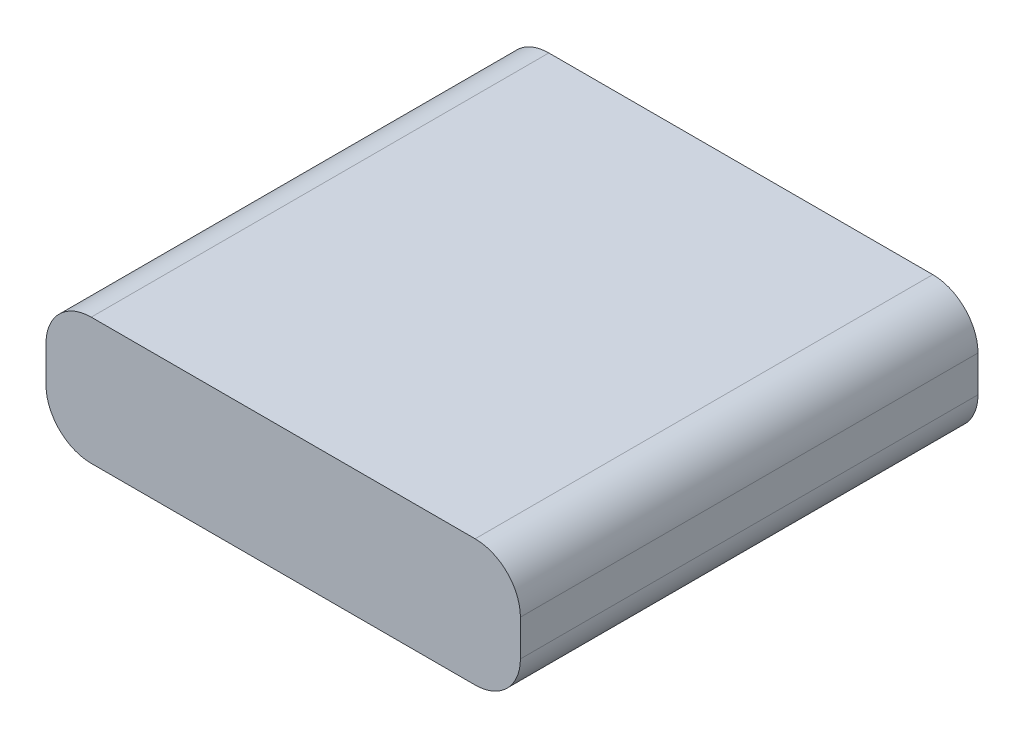
ISO-10303-21;
HEADER;
FILE_DESCRIPTION(('STEP AP214'),'2;1');
FILE_NAME('part.step','',(''),(''),'','','');
FILE_SCHEMA(('AUTOMOTIVE_DESIGN { 1 0 10303 214 1 1 1 1 }'));
ENDSEC;
DATA;
#1=APPLICATION_CONTEXT('core data for automotive mechanical design processes');
#2=APPLICATION_PROTOCOL_DEFINITION('international standard','automotive_design',2000,#1);
#3=PRODUCT_CONTEXT('',#1,'mechanical');
#4=PRODUCT('Part','Part','',(#3));
#5=PRODUCT_RELATED_PRODUCT_CATEGORY('part','',(#4));
#6=PRODUCT_DEFINITION_FORMATION('','',#4);
#7=PRODUCT_DEFINITION_CONTEXT('part definition',#1,'design');
#8=PRODUCT_DEFINITION('design','',#6,#7);
#9=PRODUCT_DEFINITION_SHAPE('','',#8);
#10=(LENGTH_UNIT() NAMED_UNIT(*) SI_UNIT(.MILLI.,.METRE.));
#11=(NAMED_UNIT(*) PLANE_ANGLE_UNIT() SI_UNIT($,.RADIAN.));
#12=(NAMED_UNIT(*) SI_UNIT($,.STERADIAN.) SOLID_ANGLE_UNIT());
#13=UNCERTAINTY_MEASURE_WITH_UNIT(LENGTH_MEASURE(1.E-05),#10,'distance_accuracy_value','');
#14=(GEOMETRIC_REPRESENTATION_CONTEXT(3) GLOBAL_UNCERTAINTY_ASSIGNED_CONTEXT((#13)) GLOBAL_UNIT_ASSIGNED_CONTEXT((#10,
#11,#12)) REPRESENTATION_CONTEXT('',''));
#15=CARTESIAN_POINT('',(0.,0.,0.));
#16=DIRECTION('',(0.,0.,1.));
#17=DIRECTION('',(1.,0.,0.));
#18=AXIS2_PLACEMENT_3D('',#15,#16,#17);
#19=CARTESIAN_POINT('',(18.35,9.8,-17.7));
#20=DIRECTION('',(-1.,0.,0.));
#21=DIRECTION('',(0.,0.,1.));
#22=AXIS2_PLACEMENT_3D('',#19,#20,#21);
#23=PLANE('',#22);
#24=DIRECTION('',(0.,-1.,0.));
#25=VECTOR('',#24,1.);
#26=CARTESIAN_POINT('',(18.35,9.8,17.7));
#27=LINE('',#26,#25);
#28=CARTESIAN_POINT('',(18.35,6.3,17.7));
#29=VERTEX_POINT('',#28);
#30=CARTESIAN_POINT('',(18.35,3.5,17.7));
#31=VERTEX_POINT('',#30);
#32=EDGE_CURVE('E105',#29,#31,#27,.T.);
#33=ORIENTED_EDGE('',*,*,#32,.T.);
#34=DIRECTION('',(0.,0.,-1.));
#35=VECTOR('',#34,1.);
#36=CARTESIAN_POINT('',(18.35,3.5,-17.7));
#37=LINE('',#36,#35);
#38=CARTESIAN_POINT('',(18.35,3.5,-17.7));
#39=VERTEX_POINT('',#38);
#40=EDGE_CURVE('E11',#31,#39,#37,.T.);
#41=ORIENTED_EDGE('',*,*,#40,.T.);
#42=DIRECTION('',(0.,-1.,0.));
#43=VECTOR('',#42,1.);
#44=CARTESIAN_POINT('',(18.35,9.8,-17.7));
#45=LINE('',#44,#43);
#46=CARTESIAN_POINT('',(18.35,6.3,-17.7));
#47=VERTEX_POINT('',#46);
#48=EDGE_CURVE('E110',#47,#39,#45,.T.);
#49=ORIENTED_EDGE('',*,*,#48,.F.);
#50=DIRECTION('',(0.,0.,-1.));
#51=VECTOR('',#50,1.);
#52=CARTESIAN_POINT('',(18.35,6.3,17.7));
#53=LINE('',#52,#51);
#54=EDGE_CURVE('E25',#47,#29,#53,.F.);
#55=ORIENTED_EDGE('',*,*,#54,.T.);
#56=EDGE_LOOP('',(#33,#41,#49,#55));
#57=FACE_BOUND('',#56,.T.);
#58=ADVANCED_FACE('F17',(#57),#23,.F.);
#59=CARTESIAN_POINT('',(-18.35,9.8,-17.7));
#60=DIRECTION('',(0.,0.,1.));
#61=DIRECTION('',(1.,0.,0.));
#62=AXIS2_PLACEMENT_3D('',#59,#60,#61);
#63=PLANE('',#62);
#64=DIRECTION('',(-1.,0.,0.));
#65=VECTOR('',#64,1.);
#66=CARTESIAN_POINT('',(-18.35,0.,-17.7));
#67=LINE('',#66,#65);
#68=CARTESIAN_POINT('',(14.85,0.,-17.7));
#69=VERTEX_POINT('',#68);
#70=CARTESIAN_POINT('',(-14.85,0.,-17.7));
#71=VERTEX_POINT('',#70);
#72=EDGE_CURVE('E152',#69,#71,#67,.T.);
#73=ORIENTED_EDGE('',*,*,#72,.T.);
#74=CARTESIAN_POINT('',(-14.85,3.5,-17.7));
#75=DIRECTION('',(0.,0.,1.));
#76=DIRECTION('',(1.,0.,0.));
#77=AXIS2_PLACEMENT_3D('',#74,#75,#76);
#78=CIRCLE('',#77,3.5);
#79=CARTESIAN_POINT('',(-18.35,3.5,-17.7));
#80=VERTEX_POINT('',#79);
#81=EDGE_CURVE('E127',#71,#80,#78,.F.);
#82=ORIENTED_EDGE('',*,*,#81,.T.);
#83=DIRECTION('',(0.,-1.,0.));
#84=VECTOR('',#83,1.);
#85=CARTESIAN_POINT('',(-18.35,9.8,-17.7));
#86=LINE('',#85,#84);
#87=CARTESIAN_POINT('',(-18.35,6.3,-17.7));
#88=VERTEX_POINT('',#87);
#89=EDGE_CURVE('E104',#88,#80,#86,.T.);
#90=ORIENTED_EDGE('',*,*,#89,.F.);
#91=CARTESIAN_POINT('',(-14.85,6.3,-17.7));
#92=DIRECTION('',(0.,0.,1.));
#93=DIRECTION('',(1.,0.,0.));
#94=AXIS2_PLACEMENT_3D('',#91,#92,#93);
#95=CIRCLE('',#94,3.5);
#96=CARTESIAN_POINT('',(-14.85,9.8,-17.7));
#97=VERTEX_POINT('',#96);
#98=EDGE_CURVE('E109',#88,#97,#95,.F.);
#99=ORIENTED_EDGE('',*,*,#98,.T.);
#100=DIRECTION('',(-1.,0.,0.));
#101=VECTOR('',#100,1.);
#102=CARTESIAN_POINT('',(-18.35,9.8,-17.7));
#103=LINE('',#102,#101);
#104=CARTESIAN_POINT('',(14.85,9.8,-17.7));
#105=VERTEX_POINT('',#104);
#106=EDGE_CURVE('E146',#105,#97,#103,.T.);
#107=ORIENTED_EDGE('',*,*,#106,.F.);
#108=CARTESIAN_POINT('',(14.85,6.3,-17.7));
#109=DIRECTION('',(0.,0.,1.));
#110=DIRECTION('',(1.,0.,0.));
#111=AXIS2_PLACEMENT_3D('',#108,#109,#110);
#112=CIRCLE('',#111,3.5);
#113=EDGE_CURVE('E39',#105,#47,#112,.F.);
#114=ORIENTED_EDGE('',*,*,#113,.T.);
#115=ORIENTED_EDGE('',*,*,#48,.T.);
#116=CARTESIAN_POINT('',(14.85,3.5,-17.7));
#117=DIRECTION('',(0.,0.,1.));
#118=DIRECTION('',(1.,0.,0.));
#119=AXIS2_PLACEMENT_3D('',#116,#117,#118);
#120=CIRCLE('',#119,3.5);
#121=EDGE_CURVE('E32',#39,#69,#120,.F.);
#122=ORIENTED_EDGE('',*,*,#121,.T.);
#123=EDGE_LOOP('',(#73,#82,#90,#99,#107,#114,#115,#122));
#124=FACE_BOUND('',#123,.T.);
#125=ADVANCED_FACE('F148',(#124),#63,.F.);
#126=CARTESIAN_POINT('',(-18.35,9.8,-17.7));
#127=DIRECTION('',(1.,0.,0.));
#128=DIRECTION('',(0.,0.,-1.));
#129=AXIS2_PLACEMENT_3D('',#126,#127,#128);
#130=PLANE('',#129);
#131=ORIENTED_EDGE('',*,*,#89,.T.);
#132=DIRECTION('',(0.,0.,1.));
#133=VECTOR('',#132,1.);
#134=CARTESIAN_POINT('',(-18.35,3.5,-17.7));
#135=LINE('',#134,#133);
#136=CARTESIAN_POINT('',(-18.35,3.5,17.7));
#137=VERTEX_POINT('',#136);
#138=EDGE_CURVE('E103',#80,#137,#135,.T.);
#139=ORIENTED_EDGE('',*,*,#138,.T.);
#140=DIRECTION('',(0.,-1.,0.));
#141=VECTOR('',#140,1.);
#142=CARTESIAN_POINT('',(-18.35,9.8,17.7));
#143=LINE('',#142,#141);
#144=CARTESIAN_POINT('',(-18.35,6.3,17.7));
#145=VERTEX_POINT('',#144);
#146=EDGE_CURVE('E86',#145,#137,#143,.T.);
#147=ORIENTED_EDGE('',*,*,#146,.F.);
#148=DIRECTION('',(0.,0.,1.));
#149=VECTOR('',#148,1.);
#150=CARTESIAN_POINT('',(-18.35,6.3,-17.7));
#151=LINE('',#150,#149);
#152=EDGE_CURVE('E100',#145,#88,#151,.F.);
#153=ORIENTED_EDGE('',*,*,#152,.T.);
#154=EDGE_LOOP('',(#131,#139,#147,#153));
#155=FACE_BOUND('',#154,.T.);
#156=ADVANCED_FACE('F99',(#155),#130,.F.);
#157=CARTESIAN_POINT('',(-18.35,9.8,17.7));
#158=DIRECTION('',(0.,0.,-1.));
#159=DIRECTION('',(-1.,0.,0.));
#160=AXIS2_PLACEMENT_3D('',#157,#158,#159);
#161=PLANE('',#160);
#162=ORIENTED_EDGE('',*,*,#146,.T.);
#163=CARTESIAN_POINT('',(-14.85,3.5,17.7));
#164=DIRECTION('',(0.,0.,-1.));
#165=DIRECTION('',(-1.,0.,0.));
#166=AXIS2_PLACEMENT_3D('',#163,#164,#165);
#167=CIRCLE('',#166,3.5);
#168=CARTESIAN_POINT('',(-14.85,0.,17.7));
#169=VERTEX_POINT('',#168);
#170=EDGE_CURVE('E93',#137,#169,#167,.F.);
#171=ORIENTED_EDGE('',*,*,#170,.T.);
#172=DIRECTION('',(1.,0.,0.));
#173=VECTOR('',#172,1.);
#174=CARTESIAN_POINT('',(-18.35,0.,17.7));
#175=LINE('',#174,#173);
#176=CARTESIAN_POINT('',(14.85,0.,17.7));
#177=VERTEX_POINT('',#176);
#178=EDGE_CURVE('E149',#169,#177,#175,.T.);
#179=ORIENTED_EDGE('',*,*,#178,.T.);
#180=CARTESIAN_POINT('',(14.85,3.5,17.7));
#181=DIRECTION('',(0.,0.,-1.));
#182=DIRECTION('',(-1.,0.,0.));
#183=AXIS2_PLACEMENT_3D('',#180,#181,#182);
#184=CIRCLE('',#183,3.5);
#185=EDGE_CURVE('E94',#177,#31,#184,.F.);
#186=ORIENTED_EDGE('',*,*,#185,.T.);
#187=ORIENTED_EDGE('',*,*,#32,.F.);
#188=CARTESIAN_POINT('',(14.85,6.3,17.7));
#189=DIRECTION('',(0.,0.,-1.));
#190=DIRECTION('',(-1.,0.,0.));
#191=AXIS2_PLACEMENT_3D('',#188,#189,#190);
#192=CIRCLE('',#191,3.5);
#193=CARTESIAN_POINT('',(14.85,9.8,17.7));
#194=VERTEX_POINT('',#193);
#195=EDGE_CURVE('E112',#29,#194,#192,.F.);
#196=ORIENTED_EDGE('',*,*,#195,.T.);
#197=DIRECTION('',(1.,0.,0.));
#198=VECTOR('',#197,1.);
#199=CARTESIAN_POINT('',(-18.35,9.8,17.7));
#200=LINE('',#199,#198);
#201=CARTESIAN_POINT('',(-14.85,9.8,17.7));
#202=VERTEX_POINT('',#201);
#203=EDGE_CURVE('E88',#202,#194,#200,.T.);
#204=ORIENTED_EDGE('',*,*,#203,.F.);
#205=CARTESIAN_POINT('',(-14.85,6.3,17.7));
#206=DIRECTION('',(0.,0.,-1.));
#207=DIRECTION('',(-1.,0.,0.));
#208=AXIS2_PLACEMENT_3D('',#205,#206,#207);
#209=CIRCLE('',#208,3.5);
#210=EDGE_CURVE('E83',#202,#145,#209,.F.);
#211=ORIENTED_EDGE('',*,*,#210,.T.);
#212=EDGE_LOOP('',(#162,#171,#179,#186,#187,#196,#204,#211));
#213=FACE_BOUND('',#212,.T.);
#214=ADVANCED_FACE('F85',(#213),#161,.F.);
#215=CARTESIAN_POINT('',(0.,9.8,0.));
#216=DIRECTION('',(0.,1.,0.));
#217=DIRECTION('',(0.,0.,1.));
#218=AXIS2_PLACEMENT_3D('',#215,#216,#217);
#219=PLANE('',#218);
#220=ORIENTED_EDGE('',*,*,#106,.T.);
#221=DIRECTION('',(0.,0.,1.));
#222=VECTOR('',#221,1.);
#223=CARTESIAN_POINT('',(-14.85,9.8,17.7));
#224=LINE('',#223,#222);
#225=EDGE_CURVE('E132',#97,#202,#224,.T.);
#226=ORIENTED_EDGE('',*,*,#225,.T.);
#227=ORIENTED_EDGE('',*,*,#203,.T.);
#228=DIRECTION('',(0.,0.,-1.));
#229=VECTOR('',#228,1.);
#230=CARTESIAN_POINT('',(14.85,9.8,-17.7));
#231=LINE('',#230,#229);
#232=EDGE_CURVE('E129',#194,#105,#231,.T.);
#233=ORIENTED_EDGE('',*,*,#232,.T.);
#234=EDGE_LOOP('',(#220,#226,#227,#233));
#235=FACE_BOUND('',#234,.T.);
#236=ADVANCED_FACE('F145',(#235),#219,.T.);
#237=CARTESIAN_POINT('',(0.,0.,0.));
#238=DIRECTION('',(0.,1.,0.));
#239=DIRECTION('',(0.,0.,1.));
#240=AXIS2_PLACEMENT_3D('',#237,#238,#239);
#241=PLANE('',#240);
#242=ORIENTED_EDGE('',*,*,#178,.F.);
#243=DIRECTION('',(0.,0.,1.));
#244=VECTOR('',#243,1.);
#245=CARTESIAN_POINT('',(-14.85,0.,0.));
#246=LINE('',#245,#244);
#247=EDGE_CURVE('E122',#169,#71,#246,.F.);
#248=ORIENTED_EDGE('',*,*,#247,.T.);
#249=ORIENTED_EDGE('',*,*,#72,.F.);
#250=DIRECTION('',(0.,0.,-1.));
#251=VECTOR('',#250,1.);
#252=CARTESIAN_POINT('',(14.85,0.,0.));
#253=LINE('',#252,#251);
#254=EDGE_CURVE('E120',#69,#177,#253,.F.);
#255=ORIENTED_EDGE('',*,*,#254,.T.);
#256=EDGE_LOOP('',(#242,#248,#249,#255));
#257=FACE_BOUND('',#256,.T.);
#258=ADVANCED_FACE('F161',(#257),#241,.F.);
#259=CARTESIAN_POINT('',(-14.85,3.5,-17.7));
#260=DIRECTION('',(0.,0.,1.));
#261=DIRECTION('',(1.,0.,0.));
#262=AXIS2_PLACEMENT_3D('',#259,#260,#261);
#263=CYLINDRICAL_SURFACE('',#262,3.5);
#264=ORIENTED_EDGE('',*,*,#81,.F.);
#265=ORIENTED_EDGE('',*,*,#247,.F.);
#266=ORIENTED_EDGE('',*,*,#170,.F.);
#267=ORIENTED_EDGE('',*,*,#138,.F.);
#268=EDGE_LOOP('',(#264,#265,#266,#267));
#269=FACE_BOUND('',#268,.T.);
#270=ADVANCED_FACE('F157',(#269),#263,.T.);
#271=CARTESIAN_POINT('',(-14.85,6.3,0.));
#272=DIRECTION('',(0.,0.,-1.));
#273=DIRECTION('',(-1.,0.,0.));
#274=AXIS2_PLACEMENT_3D('',#271,#272,#273);
#275=CYLINDRICAL_SURFACE('',#274,3.5);
#276=ORIENTED_EDGE('',*,*,#98,.F.);
#277=ORIENTED_EDGE('',*,*,#152,.F.);
#278=ORIENTED_EDGE('',*,*,#210,.F.);
#279=ORIENTED_EDGE('',*,*,#225,.F.);
#280=EDGE_LOOP('',(#276,#277,#278,#279));
#281=FACE_BOUND('',#280,.T.);
#282=ADVANCED_FACE('F108',(#281),#275,.T.);
#283=CARTESIAN_POINT('',(14.85,3.5,-17.7));
#284=DIRECTION('',(0.,0.,-1.));
#285=DIRECTION('',(-1.,0.,0.));
#286=AXIS2_PLACEMENT_3D('',#283,#284,#285);
#287=CYLINDRICAL_SURFACE('',#286,3.5);
#288=ORIENTED_EDGE('',*,*,#185,.F.);
#289=ORIENTED_EDGE('',*,*,#254,.F.);
#290=ORIENTED_EDGE('',*,*,#121,.F.);
#291=ORIENTED_EDGE('',*,*,#40,.F.);
#292=EDGE_LOOP('',(#288,#289,#290,#291));
#293=FACE_BOUND('',#292,.T.);
#294=ADVANCED_FACE('F163',(#293),#287,.T.);
#295=CARTESIAN_POINT('',(14.85,6.3,0.));
#296=DIRECTION('',(0.,0.,1.));
#297=DIRECTION('',(1.,0.,0.));
#298=AXIS2_PLACEMENT_3D('',#295,#296,#297);
#299=CYLINDRICAL_SURFACE('',#298,3.5);
#300=ORIENTED_EDGE('',*,*,#195,.F.);
#301=ORIENTED_EDGE('',*,*,#54,.F.);
#302=ORIENTED_EDGE('',*,*,#113,.F.);
#303=ORIENTED_EDGE('',*,*,#232,.F.);
#304=EDGE_LOOP('',(#300,#301,#302,#303));
#305=FACE_BOUND('',#304,.T.);
#306=ADVANCED_FACE('F19',(#305),#299,.T.);
#307=CLOSED_SHELL('',(#58,#125,#156,#214,#236,#258,#270,#282,#294,#306));
#308=MANIFOLD_SOLID_BREP('B1',#307);
#309=ADVANCED_BREP_SHAPE_REPRESENTATION('',(#18,#308),#14);
#310=SHAPE_DEFINITION_REPRESENTATION(#9,#309);
ENDSEC;
END-ISO-10303-21;
